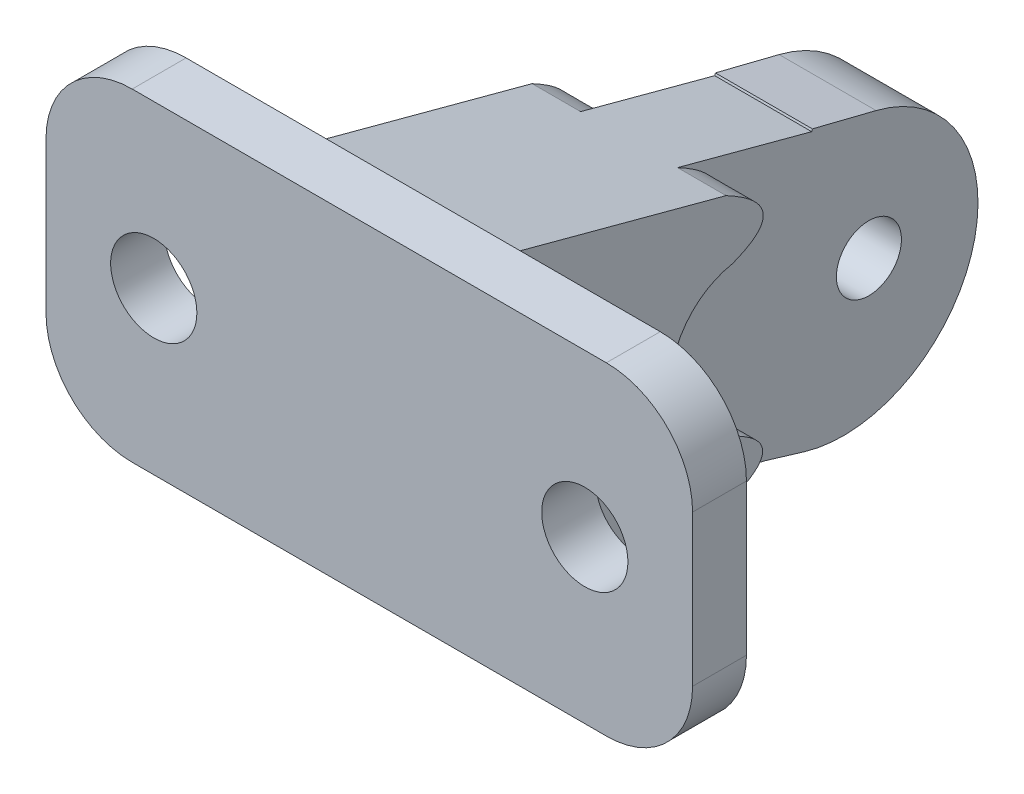
ISO-10303-21;
HEADER;
FILE_DESCRIPTION(('STEP AP214'),'2;1');
FILE_NAME('part.step','',(''),(''),'','','');
FILE_SCHEMA(('AUTOMOTIVE_DESIGN { 1 0 10303 214 1 1 1 1 }'));
ENDSEC;
DATA;
#1=APPLICATION_CONTEXT('core data for automotive mechanical design processes');
#2=APPLICATION_PROTOCOL_DEFINITION('international standard','automotive_design',2000,#1);
#3=PRODUCT_CONTEXT('',#1,'mechanical');
#4=PRODUCT('Part','Part','',(#3));
#5=PRODUCT_RELATED_PRODUCT_CATEGORY('part','',(#4));
#6=PRODUCT_DEFINITION_FORMATION('','',#4);
#7=PRODUCT_DEFINITION_CONTEXT('part definition',#1,'design');
#8=PRODUCT_DEFINITION('design','',#6,#7);
#9=PRODUCT_DEFINITION_SHAPE('','',#8);
#10=(LENGTH_UNIT() NAMED_UNIT(*) SI_UNIT(.MILLI.,.METRE.));
#11=(NAMED_UNIT(*) PLANE_ANGLE_UNIT() SI_UNIT($,.RADIAN.));
#12=(NAMED_UNIT(*) SI_UNIT($,.STERADIAN.) SOLID_ANGLE_UNIT());
#13=UNCERTAINTY_MEASURE_WITH_UNIT(LENGTH_MEASURE(1.E-05),#10,'distance_accuracy_value','');
#14=(GEOMETRIC_REPRESENTATION_CONTEXT(3) GLOBAL_UNCERTAINTY_ASSIGNED_CONTEXT((#13)) GLOBAL_UNIT_ASSIGNED_CONTEXT((#10,
#11,#12)) REPRESENTATION_CONTEXT('',''));
#15=CARTESIAN_POINT('',(0.,0.,0.));
#16=DIRECTION('',(0.,0.,1.));
#17=DIRECTION('',(1.,0.,0.));
#18=AXIS2_PLACEMENT_3D('',#15,#16,#17);
#19=CARTESIAN_POINT('',(8.99999999999999,4.11646586559281,-19.7213161621918));
#20=CARTESIAN_POINT('',(8.99999999999999,6.38873808035792,-25.6883036739418));
#21=CARTESIAN_POINT('',(8.99999999999999,9.88058286052622,-19.1059248696556));
#22=B_SPLINE_CURVE_WITH_KNOTS('',2,(#19,#20,#21),.UNSPECIFIED.,.F.,.F.,(3,3),(0.,1.),.UNSPECIFIED.);
#23=DIRECTION('',(-1.,0.,0.));
#24=VECTOR('',#23,1.);
#25=SURFACE_OF_LINEAR_EXTRUSION('',#22,#24);
#26=DIRECTION('',(-1.,0.,0.));
#27=VECTOR('',#26,1.);
#28=CARTESIAN_POINT('',(8.99999999999999,9.88058286052622,-19.1059248696556));
#29=LINE('',#28,#27);
#30=CARTESIAN_POINT('',(-4.50000000000001,9.88058286052622,-19.1059248696556));
#31=VERTEX_POINT('',#30);
#32=CARTESIAN_POINT('',(-9.00000000000001,9.88058286052622,-19.1059248696556));
#33=VERTEX_POINT('',#32);
#34=EDGE_CURVE('E386',#31,#33,#29,.T.);
#35=ORIENTED_EDGE('',*,*,#34,.F.);
#36=CARTESIAN_POINT('',(-4.50000000000001,4.11646586559281,-19.7213161621918));
#37=CARTESIAN_POINT('',(-4.50000000000001,6.38873808035793,-25.6883036739418));
#38=CARTESIAN_POINT('',(-4.50000000000001,9.88058286052622,-19.1059248696556));
#39=B_SPLINE_CURVE_WITH_KNOTS('',2,(#36,#37,#38),.UNSPECIFIED.,.F.,.F.,(3,3),(0.,1.),.UNSPECIFIED.);
#40=CARTESIAN_POINT('',(-4.50000000000001,4.11646586559281,-19.7213161621918));
#41=VERTEX_POINT('',#40);
#42=EDGE_CURVE('E294',#31,#41,#39,.F.);
#43=ORIENTED_EDGE('',*,*,#42,.T.);
#44=DIRECTION('',(-1.,0.,0.));
#45=VECTOR('',#44,1.);
#46=CARTESIAN_POINT('',(8.99999999999999,4.11646586559281,-19.7213161621918));
#47=LINE('',#46,#45);
#48=CARTESIAN_POINT('',(-9.00000000000001,4.11646586559281,-19.7213161621918));
#49=VERTEX_POINT('',#48);
#50=EDGE_CURVE('E412',#41,#49,#47,.T.);
#51=ORIENTED_EDGE('',*,*,#50,.T.);
#52=CARTESIAN_POINT('',(-9.00000000000001,4.11646586559281,-19.7213161621918));
#53=CARTESIAN_POINT('',(-9.00000000000001,6.38873808035793,-25.6883036739418));
#54=CARTESIAN_POINT('',(-9.00000000000001,9.88058286052622,-19.1059248696556));
#55=B_SPLINE_CURVE_WITH_KNOTS('',2,(#52,#53,#54),.UNSPECIFIED.,.F.,.F.,(3,3),(0.,1.),.UNSPECIFIED.);
#56=EDGE_CURVE('E382',#49,#33,#55,.T.);
#57=ORIENTED_EDGE('',*,*,#56,.T.);
#58=EDGE_LOOP('',(#35,#43,#51,#57));
#59=FACE_BOUND('',#58,.T.);
#60=ADVANCED_FACE('F42',(#59),#25,.F.);
#61=CARTESIAN_POINT('',(8.99999999999998,-15.,-19.1059248696556));
#62=CARTESIAN_POINT('',(8.99999999999998,-12.5411603426739,-25.7462796912851));
#63=CARTESIAN_POINT('',(8.99999999999998,-9.59261133202553,-19.3961013764876));
#64=B_SPLINE_CURVE_WITH_KNOTS('',2,(#61,#62,#63),.UNSPECIFIED.,.F.,.F.,(3,3),(0.,1.),.UNSPECIFIED.);
#65=DIRECTION('',(-1.,0.,0.));
#66=VECTOR('',#65,1.);
#67=SURFACE_OF_LINEAR_EXTRUSION('',#64,#66);
#68=DIRECTION('',(-1.,0.,0.));
#69=VECTOR('',#68,1.);
#70=CARTESIAN_POINT('',(8.99999999999998,-9.59261133202553,-19.3961013764876));
#71=LINE('',#70,#69);
#72=CARTESIAN_POINT('',(-4.50000000000001,-9.59261133202553,-19.3961013764876));
#73=VERTEX_POINT('',#72);
#74=CARTESIAN_POINT('',(-9.00000000000001,-9.59261133202553,-19.3961013764876));
#75=VERTEX_POINT('',#74);
#76=EDGE_CURVE('E407',#73,#75,#71,.T.);
#77=ORIENTED_EDGE('',*,*,#76,.F.);
#78=CARTESIAN_POINT('',(-4.50000000000001,-15.,-19.1059248696556));
#79=CARTESIAN_POINT('',(-4.50000000000001,-12.5411603426739,-25.7462796912851));
#80=CARTESIAN_POINT('',(-4.50000000000001,-9.59261133202553,-19.3961013764876));
#81=B_SPLINE_CURVE_WITH_KNOTS('',2,(#78,#79,#80),.UNSPECIFIED.,.F.,.F.,(3,3),(0.,1.),.UNSPECIFIED.);
#82=CARTESIAN_POINT('',(-4.50000000000001,-15.,-19.1059248696556));
#83=VERTEX_POINT('',#82);
#84=EDGE_CURVE('E510',#73,#83,#81,.F.);
#85=ORIENTED_EDGE('',*,*,#84,.T.);
#86=DIRECTION('',(-1.,0.,0.));
#87=VECTOR('',#86,1.);
#88=CARTESIAN_POINT('',(8.99999999999998,-15.,-19.1059248696556));
#89=LINE('',#88,#87);
#90=CARTESIAN_POINT('',(-9.00000000000001,-15.,-19.1059248696556));
#91=VERTEX_POINT('',#90);
#92=EDGE_CURVE('E402',#83,#91,#89,.T.);
#93=ORIENTED_EDGE('',*,*,#92,.T.);
#94=CARTESIAN_POINT('',(-9.00000000000001,-15.,-19.1059248696556));
#95=CARTESIAN_POINT('',(-9.00000000000001,-12.5411603426739,-25.7462796912851));
#96=CARTESIAN_POINT('',(-9.00000000000001,-9.59261133202553,-19.3961013764876));
#97=B_SPLINE_CURVE_WITH_KNOTS('',2,(#94,#95,#96),.UNSPECIFIED.,.F.,.F.,(3,3),(0.,1.),.UNSPECIFIED.);
#98=EDGE_CURVE('E406',#91,#75,#97,.T.);
#99=ORIENTED_EDGE('',*,*,#98,.T.);
#100=EDGE_LOOP('',(#77,#85,#93,#99));
#101=FACE_BOUND('',#100,.T.);
#102=ADVANCED_FACE('F452',(#101),#67,.F.);
#103=CARTESIAN_POINT('',(-30.,-15.,5.));
#104=DIRECTION('',(0.,1.,0.));
#105=DIRECTION('',(0.,0.,1.));
#106=AXIS2_PLACEMENT_3D('',#103,#104,#105);
#107=PLANE('',#106);
#108=ORIENTED_EDGE('',*,*,#92,.F.);
#109=DIRECTION('',(0.,0.,1.));
#110=VECTOR('',#109,1.);
#111=CARTESIAN_POINT('',(-4.50000000000001,-15.,5.));
#112=LINE('',#111,#110);
#113=CARTESIAN_POINT('',(-4.50000000000001,-15.,-16.9530599532742));
#114=VERTEX_POINT('',#113);
#115=EDGE_CURVE('E290',#83,#114,#112,.T.);
#116=ORIENTED_EDGE('',*,*,#115,.T.);
#117=DIRECTION('',(-1.,0.,0.));
#118=VECTOR('',#117,1.);
#119=CARTESIAN_POINT('',(-30.,-15.,-16.9530599532742));
#120=LINE('',#119,#118);
#121=CARTESIAN_POINT('',(4.49999999999999,-15.,-16.9530599532742));
#122=VERTEX_POINT('',#121);
#123=EDGE_CURVE('E51',#122,#114,#120,.T.);
#124=ORIENTED_EDGE('',*,*,#123,.F.);
#125=DIRECTION('',(0.,0.,-1.));
#126=VECTOR('',#125,1.);
#127=CARTESIAN_POINT('',(4.49999999999999,-15.,5.));
#128=LINE('',#127,#126);
#129=CARTESIAN_POINT('',(4.49999999999999,-15.,-19.1059248696556));
#130=VERTEX_POINT('',#129);
#131=EDGE_CURVE('E275',#122,#130,#128,.T.);
#132=ORIENTED_EDGE('',*,*,#131,.T.);
#133=CARTESIAN_POINT('',(8.99999999999998,-15.,-19.1059248696556));
#134=VERTEX_POINT('',#133);
#135=EDGE_CURVE('E398',#134,#130,#89,.T.);
#136=ORIENTED_EDGE('',*,*,#135,.F.);
#137=DIRECTION('',(0.,0.,1.));
#138=VECTOR('',#137,1.);
#139=CARTESIAN_POINT('',(8.99999999999999,-15.,-45.));
#140=LINE('',#139,#138);
#141=CARTESIAN_POINT('',(8.99999999999998,-15.,0.));
#142=VERTEX_POINT('',#141);
#143=EDGE_CURVE('E299',#134,#142,#140,.T.);
#144=ORIENTED_EDGE('',*,*,#143,.T.);
#145=DIRECTION('',(1.,0.,0.));
#146=VECTOR('',#145,1.);
#147=CARTESIAN_POINT('',(-30.,-15.,0.));
#148=LINE('',#147,#146);
#149=CARTESIAN_POINT('',(22.,-15.,0.));
#150=VERTEX_POINT('',#149);
#151=EDGE_CURVE('E353',#142,#150,#148,.T.);
#152=ORIENTED_EDGE('',*,*,#151,.T.);
#153=DIRECTION('',(0.,0.,-1.));
#154=VECTOR('',#153,1.);
#155=CARTESIAN_POINT('',(22.,-15.,5.));
#156=LINE('',#155,#154);
#157=CARTESIAN_POINT('',(22.,-15.,5.));
#158=VERTEX_POINT('',#157);
#159=EDGE_CURVE('E351',#150,#158,#156,.F.);
#160=ORIENTED_EDGE('',*,*,#159,.T.);
#161=DIRECTION('',(1.,0.,0.));
#162=VECTOR('',#161,1.);
#163=CARTESIAN_POINT('',(-30.,-15.,5.));
#164=LINE('',#163,#162);
#165=CARTESIAN_POINT('',(-22.,-15.,5.));
#166=VERTEX_POINT('',#165);
#167=EDGE_CURVE('E320',#166,#158,#164,.T.);
#168=ORIENTED_EDGE('',*,*,#167,.F.);
#169=DIRECTION('',(0.,0.,-1.));
#170=VECTOR('',#169,1.);
#171=CARTESIAN_POINT('',(-22.,-15.,5.));
#172=LINE('',#171,#170);
#173=CARTESIAN_POINT('',(-22.,-15.,0.));
#174=VERTEX_POINT('',#173);
#175=EDGE_CURVE('E347',#166,#174,#172,.T.);
#176=ORIENTED_EDGE('',*,*,#175,.T.);
#177=CARTESIAN_POINT('',(-9.00000000000002,-15.,0.));
#178=VERTEX_POINT('',#177);
#179=EDGE_CURVE('E350',#174,#178,#148,.T.);
#180=ORIENTED_EDGE('',*,*,#179,.T.);
#181=DIRECTION('',(0.,0.,1.));
#182=VECTOR('',#181,1.);
#183=CARTESIAN_POINT('',(-9.00000000000001,-15.,-45.));
#184=LINE('',#183,#182);
#185=EDGE_CURVE('E387',#91,#178,#184,.T.);
#186=ORIENTED_EDGE('',*,*,#185,.F.);
#187=EDGE_LOOP('',(#108,#116,#124,#132,#136,#144,#152,#160,#168,#176,#180,#186));
#188=FACE_BOUND('',#187,.T.);
#189=ADVANCED_FACE('F44',(#188),#107,.F.);
#190=CARTESIAN_POINT('',(8.99999999999999,15.,-45.));
#191=DIRECTION('',(-1.,0.,0.));
#192=DIRECTION('',(0.,-1.,0.));
#193=AXIS2_PLACEMENT_3D('',#190,#191,#192);
#194=PLANE('',#193);
#195=CARTESIAN_POINT('',(8.99999999999999,-2.77151856009305,-20.9685813912065));
#196=DIRECTION('',(-1.,0.,0.));
#197=DIRECTION('',(0.,-1.,0.));
#198=AXIS2_PLACEMENT_3D('',#195,#196,#197);
#199=CIRCLE('',#198,7.);
#200=CARTESIAN_POINT('',(8.99999999999998,-9.59261133202553,-19.3961013764876));
#201=VERTEX_POINT('',#200);
#202=CARTESIAN_POINT('',(8.99999999999999,4.11646586559281,-19.7213161621918));
#203=VERTEX_POINT('',#202);
#204=EDGE_CURVE('E356',#201,#203,#199,.T.);
#205=ORIENTED_EDGE('',*,*,#204,.T.);
#206=CARTESIAN_POINT('',(8.99999999999999,9.88058286052622,-19.1059248696556));
#207=VERTEX_POINT('',#206);
#208=EDGE_CURVE('E431',#203,#207,#22,.T.);
#209=ORIENTED_EDGE('',*,*,#208,.T.);
#210=DIRECTION('',(0.,0.258819045102515,0.96592582628907));
#211=VECTOR('',#210,1.);
#212=CARTESIAN_POINT('',(8.99999999999999,3.75000000000024,-41.98557158515));
#213=LINE('',#212,#211);
#214=CARTESIAN_POINT('',(8.99999999999999,15.,0.));
#215=VERTEX_POINT('',#214);
#216=EDGE_CURVE('E392',#207,#215,#213,.T.);
#217=ORIENTED_EDGE('',*,*,#216,.T.);
#218=DIRECTION('',(0.,-1.,0.));
#219=VECTOR('',#218,1.);
#220=CARTESIAN_POINT('',(8.99999999999999,15.,0.));
#221=LINE('',#220,#219);
#222=EDGE_CURVE('E388',#215,#142,#221,.T.);
#223=ORIENTED_EDGE('',*,*,#222,.T.);
#224=ORIENTED_EDGE('',*,*,#143,.F.);
#225=EDGE_CURVE('E391',#134,#201,#64,.T.);
#226=ORIENTED_EDGE('',*,*,#225,.T.);
#227=EDGE_LOOP('',(#205,#209,#217,#223,#224,#226));
#228=FACE_BOUND('',#227,.T.);
#229=ADVANCED_FACE('F465',(#228),#194,.F.);
#230=CARTESIAN_POINT('',(-9.00000000000001,15.,-45.));
#231=DIRECTION('',(1.,0.,0.));
#232=DIRECTION('',(0.,1.,0.));
#233=AXIS2_PLACEMENT_3D('',#230,#231,#232);
#234=PLANE('',#233);
#235=DIRECTION('',(0.,0.258819045102515,0.96592582628907));
#236=VECTOR('',#235,1.);
#237=CARTESIAN_POINT('',(-9.00000000000001,15.,0.));
#238=LINE('',#237,#236);
#239=CARTESIAN_POINT('',(-9.00000000000001,15.,0.));
#240=VERTEX_POINT('',#239);
#241=EDGE_CURVE('E379',#33,#240,#238,.T.);
#242=ORIENTED_EDGE('',*,*,#241,.F.);
#243=ORIENTED_EDGE('',*,*,#56,.F.);
#244=CARTESIAN_POINT('',(-9.00000000000001,-2.77151856009304,-20.9685813912065));
#245=DIRECTION('',(-1.,0.,0.));
#246=DIRECTION('',(0.,-1.,0.));
#247=AXIS2_PLACEMENT_3D('',#244,#245,#246);
#248=CIRCLE('',#247,7.);
#249=EDGE_CURVE('E411',#75,#49,#248,.T.);
#250=ORIENTED_EDGE('',*,*,#249,.F.);
#251=ORIENTED_EDGE('',*,*,#98,.F.);
#252=ORIENTED_EDGE('',*,*,#185,.T.);
#253=DIRECTION('',(0.,1.,0.));
#254=VECTOR('',#253,1.);
#255=CARTESIAN_POINT('',(-9.00000000000001,15.,0.));
#256=LINE('',#255,#254);
#257=EDGE_CURVE('E383',#178,#240,#256,.T.);
#258=ORIENTED_EDGE('',*,*,#257,.T.);
#259=EDGE_LOOP('',(#242,#243,#250,#251,#252,#258));
#260=FACE_BOUND('',#259,.T.);
#261=ADVANCED_FACE('F462',(#260),#234,.F.);
#262=CARTESIAN_POINT('',(11.,15.,0.));
#263=DIRECTION('',(0.,-0.96592582628907,0.258819045102515));
#264=DIRECTION('',(0.,-0.258819045102515,-0.96592582628907));
#265=AXIS2_PLACEMENT_3D('',#262,#263,#264);
#266=PLANE('',#265);
#267=DIRECTION('',(0.,-0.258819045102515,-0.96592582628907));
#268=VECTOR('',#267,1.);
#269=CARTESIAN_POINT('',(4.49999999999999,6.0338119321558,-33.4622694194132));
#270=LINE('',#269,#268);
#271=CARTESIAN_POINT('',(4.49999999999999,9.88058286052622,-19.1059248696556));
#272=VERTEX_POINT('',#271);
#273=CARTESIAN_POINT('',(4.49999999999999,6.54455665147159,-31.5561441772292));
#274=VERTEX_POINT('',#273);
#275=EDGE_CURVE('E257',#272,#274,#270,.T.);
#276=ORIENTED_EDGE('',*,*,#275,.T.);
#277=DIRECTION('',(-1.,0.,0.));
#278=VECTOR('',#277,1.);
#279=CARTESIAN_POINT('',(11.,6.54455665147158,-31.5561441772292));
#280=LINE('',#279,#278);
#281=CARTESIAN_POINT('',(-4.50000000000001,6.54455665147159,-31.5561441772292));
#282=VERTEX_POINT('',#281);
#283=EDGE_CURVE('E247',#274,#282,#280,.T.);
#284=ORIENTED_EDGE('',*,*,#283,.T.);
#285=DIRECTION('',(0.,0.258819045102515,0.96592582628907));
#286=VECTOR('',#285,1.);
#287=CARTESIAN_POINT('',(-4.50000000000001,6.0338119321558,-33.4622694194132));
#288=LINE('',#287,#286);
#289=EDGE_CURVE('E252',#282,#31,#288,.T.);
#290=ORIENTED_EDGE('',*,*,#289,.T.);
#291=ORIENTED_EDGE('',*,*,#34,.T.);
#292=ORIENTED_EDGE('',*,*,#241,.T.);
#293=DIRECTION('',(-1.,0.,0.));
#294=VECTOR('',#293,1.);
#295=CARTESIAN_POINT('',(11.,15.,0.));
#296=LINE('',#295,#294);
#297=EDGE_CURVE('E361',#215,#240,#296,.T.);
#298=ORIENTED_EDGE('',*,*,#297,.F.);
#299=ORIENTED_EDGE('',*,*,#216,.F.);
#300=EDGE_CURVE('E395',#207,#272,#29,.T.);
#301=ORIENTED_EDGE('',*,*,#300,.T.);
#302=EDGE_LOOP('',(#276,#284,#290,#291,#292,#298,#299,#301));
#303=FACE_BOUND('',#302,.T.);
#304=ADVANCED_FACE('F458',(#303),#266,.F.);
#305=CARTESIAN_POINT('',(0.,0.,0.));
#306=DIRECTION('',(0.,0.,1.));
#307=DIRECTION('',(1.,0.,0.));
#308=AXIS2_PLACEMENT_3D('',#305,#306,#307);
#309=PLANE('',#308);
#310=CARTESIAN_POINT('',(20.,0.,0.));
#311=DIRECTION('',(0.,0.,1.));
#312=DIRECTION('',(1.,0.,0.));
#313=AXIS2_PLACEMENT_3D('',#310,#311,#312);
#314=CIRCLE('',#313,4.);
#315=CARTESIAN_POINT('',(24.,0.,0.));
#316=VERTEX_POINT('',#315);
#317=EDGE_CURVE('E346',#316,#316,#314,.T.);
#318=ORIENTED_EDGE('',*,*,#317,.T.);
#319=EDGE_LOOP('',(#318));
#320=FACE_BOUND('',#319,.T.);
#321=ORIENTED_EDGE('',*,*,#222,.F.);
#322=DIRECTION('',(-1.,0.,0.));
#323=VECTOR('',#322,1.);
#324=CARTESIAN_POINT('',(-30.,15.,0.));
#325=LINE('',#324,#323);
#326=CARTESIAN_POINT('',(22.,15.,0.));
#327=VERTEX_POINT('',#326);
#328=EDGE_CURVE('E310',#327,#215,#325,.T.);
#329=ORIENTED_EDGE('',*,*,#328,.F.);
#330=CARTESIAN_POINT('',(22.,7.,0.));
#331=DIRECTION('',(0.,0.,1.));
#332=DIRECTION('',(1.,0.,0.));
#333=AXIS2_PLACEMENT_3D('',#330,#331,#332);
#334=CIRCLE('',#333,8.);
#335=CARTESIAN_POINT('',(30.,7.,0.));
#336=VERTEX_POINT('',#335);
#337=EDGE_CURVE('E344',#327,#336,#334,.F.);
#338=ORIENTED_EDGE('',*,*,#337,.T.);
#339=DIRECTION('',(0.,1.,0.));
#340=VECTOR('',#339,1.);
#341=CARTESIAN_POINT('',(30.,15.,0.));
#342=LINE('',#341,#340);
#343=CARTESIAN_POINT('',(30.,-7.,0.));
#344=VERTEX_POINT('',#343);
#345=EDGE_CURVE('E306',#344,#336,#342,.T.);
#346=ORIENTED_EDGE('',*,*,#345,.F.);
#347=CARTESIAN_POINT('',(22.,-7.,0.));
#348=DIRECTION('',(0.,0.,1.));
#349=DIRECTION('',(1.,0.,0.));
#350=AXIS2_PLACEMENT_3D('',#347,#348,#349);
#351=CIRCLE('',#350,8.);
#352=EDGE_CURVE('E341',#344,#150,#351,.F.);
#353=ORIENTED_EDGE('',*,*,#352,.T.);
#354=ORIENTED_EDGE('',*,*,#151,.F.);
#355=EDGE_LOOP('',(#321,#329,#338,#346,#353,#354));
#356=FACE_BOUND('',#355,.T.);
#357=ADVANCED_FACE('F461',(#320,#356),#309,.F.);
#358=CARTESIAN_POINT('',(-20.,0.,0.));
#359=DIRECTION('',(0.,0.,1.));
#360=DIRECTION('',(1.,0.,0.));
#361=AXIS2_PLACEMENT_3D('',#358,#359,#360);
#362=CIRCLE('',#361,4.);
#363=CARTESIAN_POINT('',(-16.,0.,0.));
#364=VERTEX_POINT('',#363);
#365=EDGE_CURVE('E338',#364,#364,#362,.T.);
#366=ORIENTED_EDGE('',*,*,#365,.T.);
#367=EDGE_LOOP('',(#366));
#368=FACE_BOUND('',#367,.T.);
#369=ORIENTED_EDGE('',*,*,#257,.F.);
#370=ORIENTED_EDGE('',*,*,#179,.F.);
#371=CARTESIAN_POINT('',(-22.,-7.,0.));
#372=DIRECTION('',(0.,0.,1.));
#373=DIRECTION('',(1.,0.,0.));
#374=AXIS2_PLACEMENT_3D('',#371,#372,#373);
#375=CIRCLE('',#374,8.);
#376=CARTESIAN_POINT('',(-30.,-7.,0.));
#377=VERTEX_POINT('',#376);
#378=EDGE_CURVE('E335',#174,#377,#375,.F.);
#379=ORIENTED_EDGE('',*,*,#378,.T.);
#380=DIRECTION('',(0.,-1.,0.));
#381=VECTOR('',#380,1.);
#382=CARTESIAN_POINT('',(-30.,15.,0.));
#383=LINE('',#382,#381);
#384=CARTESIAN_POINT('',(-30.,7.,0.));
#385=VERTEX_POINT('',#384);
#386=EDGE_CURVE('E317',#385,#377,#383,.T.);
#387=ORIENTED_EDGE('',*,*,#386,.F.);
#388=CARTESIAN_POINT('',(-22.,7.,0.));
#389=DIRECTION('',(0.,0.,1.));
#390=DIRECTION('',(1.,0.,0.));
#391=AXIS2_PLACEMENT_3D('',#388,#389,#390);
#392=CIRCLE('',#391,8.);
#393=CARTESIAN_POINT('',(-22.,15.,0.));
#394=VERTEX_POINT('',#393);
#395=EDGE_CURVE('E337',#385,#394,#392,.F.);
#396=ORIENTED_EDGE('',*,*,#395,.T.);
#397=EDGE_CURVE('E314',#240,#394,#325,.T.);
#398=ORIENTED_EDGE('',*,*,#397,.F.);
#399=EDGE_LOOP('',(#369,#370,#379,#387,#396,#398));
#400=FACE_BOUND('',#399,.T.);
#401=ADVANCED_FACE('F581',(#368,#400),#309,.F.);
#402=CARTESIAN_POINT('',(0.,0.,5.));
#403=DIRECTION('',(0.,0.,1.));
#404=DIRECTION('',(1.,0.,0.));
#405=AXIS2_PLACEMENT_3D('',#402,#403,#404);
#406=PLANE('',#405);
#407=CARTESIAN_POINT('',(-20.,0.,5.));
#408=DIRECTION('',(0.,0.,1.));
#409=DIRECTION('',(1.,0.,0.));
#410=AXIS2_PLACEMENT_3D('',#407,#408,#409);
#411=CIRCLE('',#410,4.);
#412=CARTESIAN_POINT('',(-16.,0.,5.));
#413=VERTEX_POINT('',#412);
#414=EDGE_CURVE('E334',#413,#413,#411,.T.);
#415=ORIENTED_EDGE('',*,*,#414,.F.);
#416=EDGE_LOOP('',(#415));
#417=FACE_BOUND('',#416,.T.);
#418=DIRECTION('',(0.,-1.,0.));
#419=VECTOR('',#418,1.);
#420=CARTESIAN_POINT('',(-30.,15.,5.));
#421=LINE('',#420,#419);
#422=CARTESIAN_POINT('',(-30.,7.,5.));
#423=VERTEX_POINT('',#422);
#424=CARTESIAN_POINT('',(-30.,-7.,5.));
#425=VERTEX_POINT('',#424);
#426=EDGE_CURVE('E321',#423,#425,#421,.T.);
#427=ORIENTED_EDGE('',*,*,#426,.T.);
#428=CARTESIAN_POINT('',(-22.,-7.,5.));
#429=DIRECTION('',(0.,0.,1.));
#430=DIRECTION('',(1.,0.,0.));
#431=AXIS2_PLACEMENT_3D('',#428,#429,#430);
#432=CIRCLE('',#431,8.);
#433=EDGE_CURVE('E318',#425,#166,#432,.T.);
#434=ORIENTED_EDGE('',*,*,#433,.T.);
#435=ORIENTED_EDGE('',*,*,#167,.T.);
#436=CARTESIAN_POINT('',(22.,-7.,5.));
#437=DIRECTION('',(0.,0.,1.));
#438=DIRECTION('',(1.,0.,0.));
#439=AXIS2_PLACEMENT_3D('',#436,#437,#438);
#440=CIRCLE('',#439,8.);
#441=CARTESIAN_POINT('',(30.,-7.,5.));
#442=VERTEX_POINT('',#441);
#443=EDGE_CURVE('E324',#158,#442,#440,.T.);
#444=ORIENTED_EDGE('',*,*,#443,.T.);
#445=DIRECTION('',(0.,1.,0.));
#446=VECTOR('',#445,1.);
#447=CARTESIAN_POINT('',(30.,15.,5.));
#448=LINE('',#447,#446);
#449=CARTESIAN_POINT('',(30.,7.,5.));
#450=VERTEX_POINT('',#449);
#451=EDGE_CURVE('E326',#442,#450,#448,.T.);
#452=ORIENTED_EDGE('',*,*,#451,.T.);
#453=CARTESIAN_POINT('',(22.,7.,5.));
#454=DIRECTION('',(0.,0.,1.));
#455=DIRECTION('',(1.,0.,0.));
#456=AXIS2_PLACEMENT_3D('',#453,#454,#455);
#457=CIRCLE('',#456,8.);
#458=CARTESIAN_POINT('',(22.,15.,5.));
#459=VERTEX_POINT('',#458);
#460=EDGE_CURVE('E327',#450,#459,#457,.T.);
#461=ORIENTED_EDGE('',*,*,#460,.T.);
#462=DIRECTION('',(-1.,0.,0.));
#463=VECTOR('',#462,1.);
#464=CARTESIAN_POINT('',(-30.,15.,5.));
#465=LINE('',#464,#463);
#466=CARTESIAN_POINT('',(-22.,15.,5.));
#467=VERTEX_POINT('',#466);
#468=EDGE_CURVE('E323',#459,#467,#465,.T.);
#469=ORIENTED_EDGE('',*,*,#468,.T.);
#470=CARTESIAN_POINT('',(-22.,7.,5.));
#471=DIRECTION('',(0.,0.,1.));
#472=DIRECTION('',(1.,0.,0.));
#473=AXIS2_PLACEMENT_3D('',#470,#471,#472);
#474=CIRCLE('',#473,8.);
#475=EDGE_CURVE('E307',#467,#423,#474,.T.);
#476=ORIENTED_EDGE('',*,*,#475,.T.);
#477=EDGE_LOOP('',(#427,#434,#435,#444,#452,#461,#469,#476));
#478=FACE_BOUND('',#477,.T.);
#479=CARTESIAN_POINT('',(20.,0.,5.));
#480=DIRECTION('',(0.,0.,1.));
#481=DIRECTION('',(1.,0.,0.));
#482=AXIS2_PLACEMENT_3D('',#479,#480,#481);
#483=CIRCLE('',#482,4.);
#484=CARTESIAN_POINT('',(24.,0.,5.));
#485=VERTEX_POINT('',#484);
#486=EDGE_CURVE('E376',#485,#485,#483,.T.);
#487=ORIENTED_EDGE('',*,*,#486,.F.);
#488=EDGE_LOOP('',(#487));
#489=FACE_BOUND('',#488,.T.);
#490=ADVANCED_FACE('F569',(#417,#478,#489),#406,.T.);
#491=CARTESIAN_POINT('',(30.,15.,5.));
#492=DIRECTION('',(-1.,0.,0.));
#493=DIRECTION('',(0.,0.,1.));
#494=AXIS2_PLACEMENT_3D('',#491,#492,#493);
#495=PLANE('',#494);
#496=ORIENTED_EDGE('',*,*,#451,.F.);
#497=DIRECTION('',(0.,0.,-1.));
#498=VECTOR('',#497,1.);
#499=CARTESIAN_POINT('',(30.,-7.,5.));
#500=LINE('',#499,#498);
#501=EDGE_CURVE('E300',#442,#344,#500,.T.);
#502=ORIENTED_EDGE('',*,*,#501,.T.);
#503=ORIENTED_EDGE('',*,*,#345,.T.);
#504=DIRECTION('',(0.,0.,-1.));
#505=VECTOR('',#504,1.);
#506=CARTESIAN_POINT('',(30.,7.,5.));
#507=LINE('',#506,#505);
#508=EDGE_CURVE('E308',#336,#450,#507,.F.);
#509=ORIENTED_EDGE('',*,*,#508,.T.);
#510=EDGE_LOOP('',(#496,#502,#503,#509));
#511=FACE_BOUND('',#510,.T.);
#512=ADVANCED_FACE('F565',(#511),#495,.F.);
#513=CARTESIAN_POINT('',(-30.,15.,5.));
#514=DIRECTION('',(0.,-1.,0.));
#515=DIRECTION('',(0.,0.,-1.));
#516=AXIS2_PLACEMENT_3D('',#513,#514,#515);
#517=PLANE('',#516);
#518=ORIENTED_EDGE('',*,*,#328,.T.);
#519=ORIENTED_EDGE('',*,*,#297,.T.);
#520=ORIENTED_EDGE('',*,*,#397,.T.);
#521=DIRECTION('',(0.,0.,-1.));
#522=VECTOR('',#521,1.);
#523=CARTESIAN_POINT('',(-22.,15.,5.));
#524=LINE('',#523,#522);
#525=EDGE_CURVE('E311',#394,#467,#524,.F.);
#526=ORIENTED_EDGE('',*,*,#525,.T.);
#527=ORIENTED_EDGE('',*,*,#468,.F.);
#528=DIRECTION('',(0.,0.,-1.));
#529=VECTOR('',#528,1.);
#530=CARTESIAN_POINT('',(22.,15.,5.));
#531=LINE('',#530,#529);
#532=EDGE_CURVE('E313',#459,#327,#531,.T.);
#533=ORIENTED_EDGE('',*,*,#532,.T.);
#534=EDGE_LOOP('',(#518,#519,#520,#526,#527,#533));
#535=FACE_BOUND('',#534,.T.);
#536=ADVANCED_FACE('F568',(#535),#517,.F.);
#537=CARTESIAN_POINT('',(-30.,15.,5.));
#538=DIRECTION('',(1.,0.,0.));
#539=DIRECTION('',(0.,1.,0.));
#540=AXIS2_PLACEMENT_3D('',#537,#538,#539);
#541=PLANE('',#540);
#542=ORIENTED_EDGE('',*,*,#386,.T.);
#543=DIRECTION('',(0.,0.,-1.));
#544=VECTOR('',#543,1.);
#545=CARTESIAN_POINT('',(-30.,-7.,5.));
#546=LINE('',#545,#544);
#547=EDGE_CURVE('E329',#377,#425,#546,.F.);
#548=ORIENTED_EDGE('',*,*,#547,.T.);
#549=ORIENTED_EDGE('',*,*,#426,.F.);
#550=DIRECTION('',(0.,0.,-1.));
#551=VECTOR('',#550,1.);
#552=CARTESIAN_POINT('',(-30.,7.,5.));
#553=LINE('',#552,#551);
#554=EDGE_CURVE('E331',#423,#385,#553,.T.);
#555=ORIENTED_EDGE('',*,*,#554,.T.);
#556=EDGE_LOOP('',(#542,#548,#549,#555));
#557=FACE_BOUND('',#556,.T.);
#558=ADVANCED_FACE('F573',(#557),#541,.F.);
#559=CARTESIAN_POINT('',(-20.,0.,5.));
#560=DIRECTION('',(0.,0.,-1.));
#561=DIRECTION('',(-1.,0.,0.));
#562=AXIS2_PLACEMENT_3D('',#559,#560,#561);
#563=CYLINDRICAL_SURFACE('',#562,4.);
#564=ORIENTED_EDGE('',*,*,#414,.T.);
#565=EDGE_LOOP('',(#564));
#566=FACE_BOUND('',#565,.T.);
#567=ORIENTED_EDGE('',*,*,#365,.F.);
#568=EDGE_LOOP('',(#567));
#569=FACE_BOUND('',#568,.T.);
#570=ADVANCED_FACE('F577',(#566,#569),#563,.F.);
#571=CARTESIAN_POINT('',(20.,0.,5.));
#572=DIRECTION('',(0.,0.,-1.));
#573=DIRECTION('',(-1.,0.,0.));
#574=AXIS2_PLACEMENT_3D('',#571,#572,#573);
#575=CYLINDRICAL_SURFACE('',#574,4.);
#576=ORIENTED_EDGE('',*,*,#486,.T.);
#577=EDGE_LOOP('',(#576));
#578=FACE_BOUND('',#577,.T.);
#579=ORIENTED_EDGE('',*,*,#317,.F.);
#580=EDGE_LOOP('',(#579));
#581=FACE_BOUND('',#580,.T.);
#582=ADVANCED_FACE('F563',(#578,#581),#575,.F.);
#583=CARTESIAN_POINT('',(-22.,-7.,5.));
#584=DIRECTION('',(0.,0.,-1.));
#585=DIRECTION('',(-1.,0.,0.));
#586=AXIS2_PLACEMENT_3D('',#583,#584,#585);
#587=CYLINDRICAL_SURFACE('',#586,8.);
#588=ORIENTED_EDGE('',*,*,#433,.F.);
#589=ORIENTED_EDGE('',*,*,#547,.F.);
#590=ORIENTED_EDGE('',*,*,#378,.F.);
#591=ORIENTED_EDGE('',*,*,#175,.F.);
#592=EDGE_LOOP('',(#588,#589,#590,#591));
#593=FACE_BOUND('',#592,.T.);
#594=ADVANCED_FACE('F559',(#593),#587,.T.);
#595=CARTESIAN_POINT('',(-22.,7.,5.));
#596=DIRECTION('',(0.,0.,-1.));
#597=DIRECTION('',(-1.,0.,0.));
#598=AXIS2_PLACEMENT_3D('',#595,#596,#597);
#599=CYLINDRICAL_SURFACE('',#598,8.);
#600=ORIENTED_EDGE('',*,*,#475,.F.);
#601=ORIENTED_EDGE('',*,*,#525,.F.);
#602=ORIENTED_EDGE('',*,*,#395,.F.);
#603=ORIENTED_EDGE('',*,*,#554,.F.);
#604=EDGE_LOOP('',(#600,#601,#602,#603));
#605=FACE_BOUND('',#604,.T.);
#606=ADVANCED_FACE('F555',(#605),#599,.T.);
#607=CARTESIAN_POINT('',(22.,-7.,5.));
#608=DIRECTION('',(0.,0.,-1.));
#609=DIRECTION('',(-1.,0.,0.));
#610=AXIS2_PLACEMENT_3D('',#607,#608,#609);
#611=CYLINDRICAL_SURFACE('',#610,8.);
#612=ORIENTED_EDGE('',*,*,#443,.F.);
#613=ORIENTED_EDGE('',*,*,#159,.F.);
#614=ORIENTED_EDGE('',*,*,#352,.F.);
#615=ORIENTED_EDGE('',*,*,#501,.F.);
#616=EDGE_LOOP('',(#612,#613,#614,#615));
#617=FACE_BOUND('',#616,.T.);
#618=ADVANCED_FACE('F486',(#617),#611,.T.);
#619=CARTESIAN_POINT('',(22.,7.,5.));
#620=DIRECTION('',(0.,0.,-1.));
#621=DIRECTION('',(-1.,0.,0.));
#622=AXIS2_PLACEMENT_3D('',#619,#620,#621);
#623=CYLINDRICAL_SURFACE('',#622,8.);
#624=ORIENTED_EDGE('',*,*,#460,.F.);
#625=ORIENTED_EDGE('',*,*,#508,.F.);
#626=ORIENTED_EDGE('',*,*,#337,.F.);
#627=ORIENTED_EDGE('',*,*,#532,.F.);
#628=EDGE_LOOP('',(#624,#625,#626,#627));
#629=FACE_BOUND('',#628,.T.);
#630=ADVANCED_FACE('F482',(#629),#623,.T.);
#631=CARTESIAN_POINT('',(4.49999999999999,4.11646586559281,-19.7213161621918));
#632=VERTEX_POINT('',#631);
#633=EDGE_CURVE('E408',#203,#632,#47,.T.);
#634=ORIENTED_EDGE('',*,*,#633,.T.);
#635=CARTESIAN_POINT('',(4.49999999999999,4.11646586559281,-19.7213161621918));
#636=CARTESIAN_POINT('',(4.49999999999999,6.38873808035792,-25.6883036739418));
#637=CARTESIAN_POINT('',(4.49999999999999,9.88058286052622,-19.1059248696556));
#638=B_SPLINE_CURVE_WITH_KNOTS('',2,(#635,#636,#637),.UNSPECIFIED.,.F.,.F.,(3,3),(0.,1.),.UNSPECIFIED.);
#639=EDGE_CURVE('E279',#632,#272,#638,.T.);
#640=ORIENTED_EDGE('',*,*,#639,.T.);
#641=ORIENTED_EDGE('',*,*,#300,.F.);
#642=ORIENTED_EDGE('',*,*,#208,.F.);
#643=EDGE_LOOP('',(#634,#640,#641,#642));
#644=FACE_BOUND('',#643,.T.);
#645=ADVANCED_FACE('F453',(#644),#25,.F.);
#646=CARTESIAN_POINT('',(8.99999999999999,-2.77151856009305,-20.9685813912065));
#647=DIRECTION('',(-1.,0.,0.));
#648=DIRECTION('',(0.,-1.,0.));
#649=AXIS2_PLACEMENT_3D('',#646,#647,#648);
#650=CYLINDRICAL_SURFACE('',#649,7.);
#651=ORIENTED_EDGE('',*,*,#50,.F.);
#652=CARTESIAN_POINT('',(-4.50000000000001,-2.77151856009304,-20.9685813912065));
#653=DIRECTION('',(-1.,0.,0.));
#654=DIRECTION('',(0.,-1.,0.));
#655=AXIS2_PLACEMENT_3D('',#652,#653,#654);
#656=CIRCLE('',#655,7.);
#657=CARTESIAN_POINT('',(-4.50000000000001,0.0918909942073404,-14.581024289752));
#658=VERTEX_POINT('',#657);
#659=EDGE_CURVE('E291',#41,#658,#656,.F.);
#660=ORIENTED_EDGE('',*,*,#659,.T.);
#661=DIRECTION('',(-1.,0.,0.));
#662=VECTOR('',#661,1.);
#663=CARTESIAN_POINT('',(8.99999999999999,0.0918909942073378,-14.581024289752));
#664=LINE('',#663,#662);
#665=CARTESIAN_POINT('',(4.49999999999999,0.0918909942073384,-14.581024289752));
#666=VERTEX_POINT('',#665);
#667=EDGE_CURVE('E496',#658,#666,#664,.F.);
#668=ORIENTED_EDGE('',*,*,#667,.T.);
#669=CARTESIAN_POINT('',(4.49999999999999,-2.77151856009305,-20.9685813912065));
#670=DIRECTION('',(1.,0.,0.));
#671=DIRECTION('',(0.,1.,0.));
#672=AXIS2_PLACEMENT_3D('',#669,#670,#671);
#673=CIRCLE('',#672,7.);
#674=EDGE_CURVE('E276',#666,#632,#673,.F.);
#675=ORIENTED_EDGE('',*,*,#674,.T.);
#676=ORIENTED_EDGE('',*,*,#633,.F.);
#677=ORIENTED_EDGE('',*,*,#204,.F.);
#678=CARTESIAN_POINT('',(4.49999999999999,-9.59261133202553,-19.3961013764876));
#679=VERTEX_POINT('',#678);
#680=EDGE_CURVE('E403',#201,#679,#71,.T.);
#681=ORIENTED_EDGE('',*,*,#680,.T.);
#682=CARTESIAN_POINT('',(4.49999999999999,-2.05752542482911,-14.005089896073));
#683=VERTEX_POINT('',#682);
#684=EDGE_CURVE('E65',#679,#683,#673,.F.);
#685=ORIENTED_EDGE('',*,*,#684,.T.);
#686=DIRECTION('',(-1.,0.,0.));
#687=VECTOR('',#686,1.);
#688=CARTESIAN_POINT('',(8.99999999999999,-2.05752542482912,-14.005089896073));
#689=LINE('',#688,#687);
#690=CARTESIAN_POINT('',(-4.50000000000001,-2.05752542482911,-14.005089896073));
#691=VERTEX_POINT('',#690);
#692=EDGE_CURVE('E518',#683,#691,#689,.T.);
#693=ORIENTED_EDGE('',*,*,#692,.T.);
#694=EDGE_CURVE('E284',#691,#73,#656,.F.);
#695=ORIENTED_EDGE('',*,*,#694,.T.);
#696=ORIENTED_EDGE('',*,*,#76,.T.);
#697=ORIENTED_EDGE('',*,*,#249,.T.);
#698=EDGE_LOOP('',(#651,#660,#668,#675,#676,#677,#681,#685,#693,#695,#696,#697));
#699=FACE_BOUND('',#698,.T.);
#700=ADVANCED_FACE('F450',(#699),#650,.F.);
#701=ORIENTED_EDGE('',*,*,#135,.T.);
#702=CARTESIAN_POINT('',(4.49999999999999,-15.,-19.1059248696556));
#703=CARTESIAN_POINT('',(4.49999999999999,-12.5411603426739,-25.7462796912851));
#704=CARTESIAN_POINT('',(4.49999999999999,-9.59261133202553,-19.3961013764876));
#705=B_SPLINE_CURVE_WITH_KNOTS('',2,(#702,#703,#704),.UNSPECIFIED.,.F.,.F.,(3,3),(0.,1.),.UNSPECIFIED.);
#706=EDGE_CURVE('E401',#130,#679,#705,.T.);
#707=ORIENTED_EDGE('',*,*,#706,.T.);
#708=ORIENTED_EDGE('',*,*,#680,.F.);
#709=ORIENTED_EDGE('',*,*,#225,.F.);
#710=EDGE_LOOP('',(#701,#707,#708,#709));
#711=FACE_BOUND('',#710,.T.);
#712=ADVANCED_FACE('F445',(#711),#67,.F.);
#713=CARTESIAN_POINT('',(0.,-9.75692554006489,2.61436031907092));
#714=DIRECTION('',(0.,0.96592582628907,-0.258819045102515));
#715=DIRECTION('',(0.,0.258819045102515,0.96592582628907));
#716=AXIS2_PLACEMENT_3D('',#713,#714,#715);
#717=PLANE('',#716);
#718=DIRECTION('',(0.,-0.258819045102515,-0.96592582628907));
#719=VECTOR('',#718,1.);
#720=CARTESIAN_POINT('',(4.49999999999999,-17.7183041362924,-27.0979091003424));
#721=LINE('',#720,#719);
#722=CARTESIAN_POINT('',(4.49999999999999,-17.7183041362924,-27.0979091003424));
#723=VERTEX_POINT('',#722);
#724=EDGE_CURVE('E256',#122,#723,#721,.T.);
#725=ORIENTED_EDGE('',*,*,#724,.F.);
#726=ORIENTED_EDGE('',*,*,#123,.T.);
#727=DIRECTION('',(0.,0.258819045102515,0.96592582628907));
#728=VECTOR('',#727,1.);
#729=CARTESIAN_POINT('',(-4.50000000000001,-17.7183041362924,-27.0979091003424));
#730=LINE('',#729,#728);
#731=CARTESIAN_POINT('',(-4.50000000000001,-17.7183041362924,-27.0979091003424));
#732=VERTEX_POINT('',#731);
#733=EDGE_CURVE('E253',#732,#114,#730,.T.);
#734=ORIENTED_EDGE('',*,*,#733,.F.);
#735=DIRECTION('',(-1.,0.,0.));
#736=VECTOR('',#735,1.);
#737=CARTESIAN_POINT('',(-4.50000000000001,-17.7183041362924,-27.0979091003424));
#738=LINE('',#737,#736);
#739=EDGE_CURVE('E259',#723,#732,#738,.T.);
#740=ORIENTED_EDGE('',*,*,#739,.F.);
#741=EDGE_LOOP('',(#725,#726,#734,#740));
#742=FACE_BOUND('',#741,.T.);
#743=ADVANCED_FACE('F449',(#742),#717,.F.);
#744=CARTESIAN_POINT('',(-4.50000000000001,-13.3960260830804,-10.9669478013149));
#745=DIRECTION('',(0.,0.258819045102515,0.96592582628907));
#746=DIRECTION('',(0.,-0.96592582628907,0.258819045102515));
#747=AXIS2_PLACEMENT_3D('',#744,#745,#746);
#748=PLANE('',#747);
#749=ORIENTED_EDGE('',*,*,#667,.F.);
#750=DIRECTION('',(0.,0.96592582628907,-0.258819045102515));
#751=VECTOR('',#750,1.);
#752=CARTESIAN_POINT('',(-4.50000000000001,-13.3960260830804,-10.9669478013149));
#753=LINE('',#752,#751);
#754=EDGE_CURVE('E262',#691,#658,#753,.T.);
#755=ORIENTED_EDGE('',*,*,#754,.F.);
#756=ORIENTED_EDGE('',*,*,#692,.F.);
#757=DIRECTION('',(0.,0.96592582628907,-0.258819045102515));
#758=VECTOR('',#757,1.);
#759=CARTESIAN_POINT('',(4.49999999999999,-13.3960260830804,-10.9669478013149));
#760=LINE('',#759,#758);
#761=EDGE_CURVE('E58',#683,#666,#760,.T.);
#762=ORIENTED_EDGE('',*,*,#761,.T.);
#763=EDGE_LOOP('',(#749,#755,#756,#762));
#764=FACE_BOUND('',#763,.T.);
#765=ADVANCED_FACE('F539',(#764),#748,.T.);
#766=CARTESIAN_POINT('',(-4.50000000000001,-17.7183041362924,-27.0979091003424));
#767=DIRECTION('',(-1.,0.,0.));
#768=DIRECTION('',(0.,-1.,0.));
#769=AXIS2_PLACEMENT_3D('',#766,#767,#768);
#770=PLANE('',#769);
#771=CARTESIAN_POINT('',(-4.50000000000001,-6.27331282060885,-36.8635473018864));
#772=DIRECTION('',(-1.,0.,0.));
#773=DIRECTION('',(0.,-1.,0.));
#774=AXIS2_PLACEMENT_3D('',#771,#772,#773);
#775=CIRCLE('',#774,3.01727359855432);
#776=CARTESIAN_POINT('',(-4.50000000000001,-9.29058641916317,-36.8635473018864));
#777=VERTEX_POINT('',#776);
#778=EDGE_CURVE('E641',#777,#777,#775,.T.);
#779=ORIENTED_EDGE('',*,*,#778,.F.);
#780=EDGE_LOOP('',(#779));
#781=FACE_BOUND('',#780,.T.);
#782=ORIENTED_EDGE('',*,*,#289,.F.);
#783=DIRECTION('',(0.,-0.957659429834369,0.287903484607797));
#784=VECTOR('',#783,1.);
#785=CARTESIAN_POINT('',(-4.50000000000001,38.624194040176,-41.2003236229011));
#786=LINE('',#785,#784);
#787=CARTESIAN_POINT('',(-4.50000000000001,6.73985876989312,-31.6148583283074));
#788=VERTEX_POINT('',#787);
#789=EDGE_CURVE('E625',#788,#282,#786,.T.);
#790=ORIENTED_EDGE('',*,*,#789,.F.);
#791=DIRECTION('',(0.,0.243519989938266,0.9698958781748));
#792=VECTOR('',#791,1.);
#793=CARTESIAN_POINT('',(-4.50000000000001,5.25433556967988,-37.5314273507729));
#794=LINE('',#793,#792);
#795=CARTESIAN_POINT('',(-4.50000000000001,5.25433556967988,-37.5314273507729));
#796=VERTEX_POINT('',#795);
#797=EDGE_CURVE('E237',#796,#788,#794,.T.);
#798=ORIENTED_EDGE('',*,*,#797,.F.);
#799=CARTESIAN_POINT('',(-4.50000000000001,-6.86936290750512,-34.4874274765446));
#800=DIRECTION('',(-1.,0.,0.));
#801=DIRECTION('',(0.,0.,1.));
#802=AXIS2_PLACEMENT_3D('',#799,#800,#801);
#803=CIRCLE('',#802,12.5);
#804=CARTESIAN_POINT('',(-4.50000000000001,-18.8401057804347,-30.8886339189472));
#805=VERTEX_POINT('',#804);
#806=EDGE_CURVE('E232',#805,#796,#803,.F.);
#807=ORIENTED_EDGE('',*,*,#806,.F.);
#808=DIRECTION('',(0.,-0.287903484607797,-0.957659429834369));
#809=VECTOR('',#808,1.);
#810=CARTESIAN_POINT('',(-4.50000000000001,-16.9200528902174,-24.5019215156489));
#811=LINE('',#810,#809);
#812=CARTESIAN_POINT('',(-4.50000000000001,-17.7018189090526,-27.1023263036684));
#813=VERTEX_POINT('',#812);
#814=EDGE_CURVE('E221',#813,#805,#811,.T.);
#815=ORIENTED_EDGE('',*,*,#814,.F.);
#816=DIRECTION('',(0.,0.96592582628907,-0.258819045102515));
#817=VECTOR('',#816,1.);
#818=CARTESIAN_POINT('',(-4.50000000000001,-17.7183041362924,-27.0979091003424));
#819=LINE('',#818,#817);
#820=EDGE_CURVE('E266',#732,#813,#819,.T.);
#821=ORIENTED_EDGE('',*,*,#820,.F.);
#822=ORIENTED_EDGE('',*,*,#733,.T.);
#823=ORIENTED_EDGE('',*,*,#115,.F.);
#824=ORIENTED_EDGE('',*,*,#84,.F.);
#825=ORIENTED_EDGE('',*,*,#694,.F.);
#826=ORIENTED_EDGE('',*,*,#754,.T.);
#827=ORIENTED_EDGE('',*,*,#659,.F.);
#828=ORIENTED_EDGE('',*,*,#42,.F.);
#829=EDGE_LOOP('',(#782,#790,#798,#807,#815,#821,#822,#823,#824,#825,#826,#827,#828));
#830=FACE_BOUND('',#829,.T.);
#831=ADVANCED_FACE('F234',(#781,#830),#770,.T.);
#832=CARTESIAN_POINT('',(4.49999999999999,-17.7183041362924,-27.0979091003424));
#833=DIRECTION('',(1.,0.,0.));
#834=DIRECTION('',(0.,1.,0.));
#835=AXIS2_PLACEMENT_3D('',#832,#833,#834);
#836=PLANE('',#835);
#837=CARTESIAN_POINT('',(4.49999999999999,-6.27331282060885,-36.8635473018864));
#838=DIRECTION('',(1.,0.,0.));
#839=DIRECTION('',(0.,1.,0.));
#840=AXIS2_PLACEMENT_3D('',#837,#838,#839);
#841=CIRCLE('',#840,3.01727359855432);
#842=CARTESIAN_POINT('',(4.49999999999999,-3.25603922205453,-36.8635473018864));
#843=VERTEX_POINT('',#842);
#844=EDGE_CURVE('E46',#843,#843,#841,.T.);
#845=ORIENTED_EDGE('',*,*,#844,.F.);
#846=EDGE_LOOP('',(#845));
#847=FACE_BOUND('',#846,.T.);
#848=DIRECTION('',(0.,-0.957659429834369,0.287903484607797));
#849=VECTOR('',#848,1.);
#850=CARTESIAN_POINT('',(4.49999999999999,38.624194040176,-41.2003236229011));
#851=LINE('',#850,#849);
#852=CARTESIAN_POINT('',(4.49999999999999,6.73985876989312,-31.6148583283074));
#853=VERTEX_POINT('',#852);
#854=EDGE_CURVE('E500',#853,#274,#851,.T.);
#855=ORIENTED_EDGE('',*,*,#854,.T.);
#856=ORIENTED_EDGE('',*,*,#275,.F.);
#857=ORIENTED_EDGE('',*,*,#639,.F.);
#858=ORIENTED_EDGE('',*,*,#674,.F.);
#859=ORIENTED_EDGE('',*,*,#761,.F.);
#860=ORIENTED_EDGE('',*,*,#684,.F.);
#861=ORIENTED_EDGE('',*,*,#706,.F.);
#862=ORIENTED_EDGE('',*,*,#131,.F.);
#863=ORIENTED_EDGE('',*,*,#724,.T.);
#864=DIRECTION('',(0.,0.96592582628907,-0.258819045102515));
#865=VECTOR('',#864,1.);
#866=CARTESIAN_POINT('',(4.49999999999999,-17.7183041362924,-27.0979091003424));
#867=LINE('',#866,#865);
#868=CARTESIAN_POINT('',(4.49999999999998,-17.7018189090526,-27.1023263036684));
#869=VERTEX_POINT('',#868);
#870=EDGE_CURVE('E268',#723,#869,#867,.T.);
#871=ORIENTED_EDGE('',*,*,#870,.T.);
#872=DIRECTION('',(0.,0.287903484607797,0.957659429834369));
#873=VECTOR('',#872,1.);
#874=CARTESIAN_POINT('',(4.49999999999998,-16.9200528902174,-24.5019215156489));
#875=LINE('',#874,#873);
#876=CARTESIAN_POINT('',(4.49999999999999,-18.8401057804347,-30.8886339189472));
#877=VERTEX_POINT('',#876);
#878=EDGE_CURVE('E229',#877,#869,#875,.T.);
#879=ORIENTED_EDGE('',*,*,#878,.F.);
#880=CARTESIAN_POINT('',(4.49999999999999,-6.86936290750512,-34.4874274765446));
#881=DIRECTION('',(1.,0.,0.));
#882=DIRECTION('',(0.,0.,-1.));
#883=AXIS2_PLACEMENT_3D('',#880,#881,#882);
#884=CIRCLE('',#883,12.5);
#885=CARTESIAN_POINT('',(4.49999999999999,5.25433556967988,-37.5314273507729));
#886=VERTEX_POINT('',#885);
#887=EDGE_CURVE('E244',#886,#877,#884,.F.);
#888=ORIENTED_EDGE('',*,*,#887,.F.);
#889=DIRECTION('',(0.,-0.243519989938266,-0.9698958781748));
#890=VECTOR('',#889,1.);
#891=CARTESIAN_POINT('',(4.49999999999999,5.25433556967988,-37.5314273507729));
#892=LINE('',#891,#890);
#893=EDGE_CURVE('E627',#853,#886,#892,.T.);
#894=ORIENTED_EDGE('',*,*,#893,.F.);
#895=EDGE_LOOP('',(#855,#856,#857,#858,#859,#860,#861,#862,#863,#871,#879,#888,#894));
#896=FACE_BOUND('',#895,.T.);
#897=ADVANCED_FACE('F498',(#847,#896),#836,.T.);
#898=CARTESIAN_POINT('',(-4.50000000000001,-17.7183041362924,-27.0979091003424));
#899=DIRECTION('',(0.,-0.258819045102515,-0.96592582628907));
#900=DIRECTION('',(0.,0.96592582628907,-0.258819045102515));
#901=AXIS2_PLACEMENT_3D('',#898,#899,#900);
#902=PLANE('',#901);
#903=DIRECTION('',(-1.,0.,0.));
#904=VECTOR('',#903,1.);
#905=CARTESIAN_POINT('',(-4.50000000000001,-17.7018189090526,-27.1023263036684));
#906=LINE('',#905,#904);
#907=EDGE_CURVE('E12',#869,#813,#906,.T.);
#908=ORIENTED_EDGE('',*,*,#907,.F.);
#909=ORIENTED_EDGE('',*,*,#870,.F.);
#910=ORIENTED_EDGE('',*,*,#739,.T.);
#911=ORIENTED_EDGE('',*,*,#820,.T.);
#912=EDGE_LOOP('',(#908,#909,#910,#911));
#913=FACE_BOUND('',#912,.T.);
#914=ADVANCED_FACE('F651',(#913),#902,.T.);
#915=CARTESIAN_POINT('',(-4.50000000000001,38.624194040176,-41.2003236229011));
#916=DIRECTION('',(0.,0.287903484607797,0.957659429834369));
#917=DIRECTION('',(0.,-0.957659429834369,0.287903484607797));
#918=AXIS2_PLACEMENT_3D('',#915,#916,#917);
#919=PLANE('',#918);
#920=ORIENTED_EDGE('',*,*,#283,.F.);
#921=ORIENTED_EDGE('',*,*,#854,.F.);
#922=DIRECTION('',(1.,0.,0.));
#923=VECTOR('',#922,1.);
#924=CARTESIAN_POINT('',(8.99999999999999,6.73985876989311,-31.6148583283074));
#925=LINE('',#924,#923);
#926=EDGE_CURVE('E633',#788,#853,#925,.T.);
#927=ORIENTED_EDGE('',*,*,#926,.F.);
#928=ORIENTED_EDGE('',*,*,#789,.T.);
#929=EDGE_LOOP('',(#920,#921,#927,#928));
#930=FACE_BOUND('',#929,.T.);
#931=ADVANCED_FACE('F655',(#930),#919,.T.);
#932=CARTESIAN_POINT('',(8.99999999999999,-6.86936290750512,-34.4874274765446));
#933=DIRECTION('',(-1.,0.,0.));
#934=DIRECTION('',(0.,-1.,0.));
#935=AXIS2_PLACEMENT_3D('',#932,#933,#934);
#936=CYLINDRICAL_SURFACE('',#935,12.5);
#937=DIRECTION('',(-1.,0.,0.));
#938=VECTOR('',#937,1.);
#939=CARTESIAN_POINT('',(8.99999999999998,-18.8401057804347,-30.8886339189472));
#940=LINE('',#939,#938);
#941=EDGE_CURVE('E225',#877,#805,#940,.T.);
#942=ORIENTED_EDGE('',*,*,#941,.T.);
#943=ORIENTED_EDGE('',*,*,#806,.T.);
#944=DIRECTION('',(-1.,0.,0.));
#945=VECTOR('',#944,1.);
#946=CARTESIAN_POINT('',(8.99999999999999,5.25433556967988,-37.5314273507729));
#947=LINE('',#946,#945);
#948=EDGE_CURVE('E245',#886,#796,#947,.T.);
#949=ORIENTED_EDGE('',*,*,#948,.F.);
#950=ORIENTED_EDGE('',*,*,#887,.T.);
#951=EDGE_LOOP('',(#942,#943,#949,#950));
#952=FACE_BOUND('',#951,.T.);
#953=ADVANCED_FACE('F243',(#952),#936,.T.);
#954=CARTESIAN_POINT('',(8.99999999999999,5.25433556967988,-37.5314273507729));
#955=DIRECTION('',(0.,0.9698958781748,-0.243519989938266));
#956=DIRECTION('',(0.,0.243519989938266,0.9698958781748));
#957=AXIS2_PLACEMENT_3D('',#954,#955,#956);
#958=PLANE('',#957);
#959=ORIENTED_EDGE('',*,*,#948,.T.);
#960=ORIENTED_EDGE('',*,*,#797,.T.);
#961=ORIENTED_EDGE('',*,*,#926,.T.);
#962=ORIENTED_EDGE('',*,*,#893,.T.);
#963=EDGE_LOOP('',(#959,#960,#961,#962));
#964=FACE_BOUND('',#963,.T.);
#965=ADVANCED_FACE('F631',(#964),#958,.T.);
#966=CARTESIAN_POINT('',(8.99999999999998,-18.8401057804347,-30.8886339189472));
#967=DIRECTION('',(0.,-0.957659429834369,0.287903484607797));
#968=DIRECTION('',(0.,-0.287903484607797,-0.957659429834369));
#969=AXIS2_PLACEMENT_3D('',#966,#967,#968);
#970=PLANE('',#969);
#971=ORIENTED_EDGE('',*,*,#878,.T.);
#972=ORIENTED_EDGE('',*,*,#907,.T.);
#973=ORIENTED_EDGE('',*,*,#814,.T.);
#974=ORIENTED_EDGE('',*,*,#941,.F.);
#975=EDGE_LOOP('',(#971,#972,#973,#974));
#976=FACE_BOUND('',#975,.T.);
#977=ADVANCED_FACE('F223',(#976),#970,.T.);
#978=CARTESIAN_POINT('',(20.09,-6.27331282060885,-36.8635473018864));
#979=DIRECTION('',(-1.,0.,0.));
#980=DIRECTION('',(0.,-1.,0.));
#981=AXIS2_PLACEMENT_3D('',#978,#979,#980);
#982=CYLINDRICAL_SURFACE('',#981,3.01727359855432);
#983=ORIENTED_EDGE('',*,*,#844,.T.);
#984=EDGE_LOOP('',(#983));
#985=FACE_BOUND('',#984,.T.);
#986=ORIENTED_EDGE('',*,*,#778,.T.);
#987=EDGE_LOOP('',(#986));
#988=FACE_BOUND('',#987,.T.);
#989=ADVANCED_FACE('F648',(#985,#988),#982,.F.);
#990=CLOSED_SHELL('',(#60,#102,#189,#229,#261,#304,#357,#401,#490,#512,#536,#558,#570,#582,#594,
#606,#618,#630,#645,#700,#712,#743,#765,#831,#897,#914,#931,#953,#965,#977,#989));
#991=MANIFOLD_SOLID_BREP('B2',#990);
#992=ADVANCED_BREP_SHAPE_REPRESENTATION('',(#18,#991),#14);
#993=SHAPE_DEFINITION_REPRESENTATION(#9,#992);
ENDSEC;
END-ISO-10303-21;
